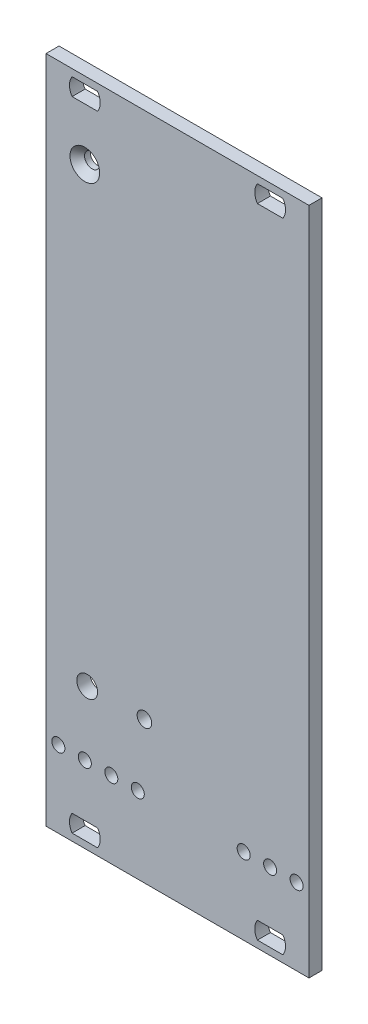
ISO-10303-21;
HEADER;
FILE_DESCRIPTION(('STEP AP214'),'2;1');
FILE_NAME('part.step','',(''),(''),'','','');
FILE_SCHEMA(('AUTOMOTIVE_DESIGN { 1 0 10303 214 1 1 1 1 }'));
ENDSEC;
DATA;
#1=APPLICATION_CONTEXT('core data for automotive mechanical design processes');
#2=APPLICATION_PROTOCOL_DEFINITION('international standard','automotive_design',2000,#1);
#3=PRODUCT_CONTEXT('',#1,'mechanical');
#4=PRODUCT('Part','Part','',(#3));
#5=PRODUCT_RELATED_PRODUCT_CATEGORY('part','',(#4));
#6=PRODUCT_DEFINITION_FORMATION('','',#4);
#7=PRODUCT_DEFINITION_CONTEXT('part definition',#1,'design');
#8=PRODUCT_DEFINITION('design','',#6,#7);
#9=PRODUCT_DEFINITION_SHAPE('','',#8);
#10=(LENGTH_UNIT() NAMED_UNIT(*) SI_UNIT(.MILLI.,.METRE.));
#11=(NAMED_UNIT(*) PLANE_ANGLE_UNIT() SI_UNIT($,.RADIAN.));
#12=(NAMED_UNIT(*) SI_UNIT($,.STERADIAN.) SOLID_ANGLE_UNIT());
#13=UNCERTAINTY_MEASURE_WITH_UNIT(LENGTH_MEASURE(1.E-05),#10,'distance_accuracy_value','');
#14=(GEOMETRIC_REPRESENTATION_CONTEXT(3) GLOBAL_UNCERTAINTY_ASSIGNED_CONTEXT((#13)) GLOBAL_UNIT_ASSIGNED_CONTEXT((#10,
#11,#12)) REPRESENTATION_CONTEXT('',''));
#15=CARTESIAN_POINT('',(0.,0.,0.));
#16=DIRECTION('',(0.,0.,1.));
#17=DIRECTION('',(1.,0.,0.));
#18=AXIS2_PLACEMENT_3D('',#15,#16,#17);
#19=CARTESIAN_POINT('',(0.,0.,2.5));
#20=DIRECTION('',(0.,0.,-1.));
#21=DIRECTION('',(-1.,0.,0.));
#22=AXIS2_PLACEMENT_3D('',#19,#20,#21);
#23=PLANE('',#22);
#24=CARTESIAN_POINT('',(7.90057350751283,27.2004615016538,2.5));
#25=DIRECTION('',(0.,0.,1.));
#26=DIRECTION('',(1.,0.,0.));
#27=AXIS2_PLACEMENT_3D('',#24,#25,#26);
#28=CIRCLE('',#27,2.);
#29=CARTESIAN_POINT('',(9.90057350751283,27.2004615016538,2.5));
#30=VERTEX_POINT('',#29);
#31=EDGE_CURVE('E776',#30,#30,#28,.T.);
#32=ORIENTED_EDGE('',*,*,#31,.F.);
#33=EDGE_LOOP('',(#32));
#34=FACE_BOUND('',#33,.T.);
#35=CARTESIAN_POINT('',(18.8873679253856,27.2115592669931,2.5));
#36=DIRECTION('',(0.,0.,1.));
#37=DIRECTION('',(1.,0.,0.));
#38=AXIS2_PLACEMENT_3D('',#35,#36,#37);
#39=CIRCLE('',#38,1.4);
#40=CARTESIAN_POINT('',(20.2873679253856,27.2115592669931,2.5));
#41=VERTEX_POINT('',#40);
#42=EDGE_CURVE('E778',#41,#41,#39,.T.);
#43=ORIENTED_EDGE('',*,*,#42,.F.);
#44=EDGE_LOOP('',(#43));
#45=FACE_BOUND('',#44,.T.);
#46=CARTESIAN_POINT('',(7.45,113.7,2.5));
#47=DIRECTION('',(0.,0.,-1.));
#48=DIRECTION('',(-1.,0.,0.));
#49=AXIS2_PLACEMENT_3D('',#46,#47,#48);
#50=CIRCLE('',#49,2.85000000000003);
#51=CARTESIAN_POINT('',(4.59999999999997,113.7,2.5));
#52=VERTEX_POINT('',#51);
#53=EDGE_CURVE('E11',#52,#52,#50,.T.);
#54=ORIENTED_EDGE('',*,*,#53,.T.);
#55=EDGE_LOOP('',(#54));
#56=FACE_BOUND('',#55,.T.);
#57=CARTESIAN_POINT('',(43.01,3.,2.5));
#58=DIRECTION('',(0.,0.,1.));
#59=DIRECTION('',(-1.,0.,0.));
#60=AXIS2_PLACEMENT_3D('',#57,#58,#59);
#61=CIRCLE('',#60,2.95);
#62=CARTESIAN_POINT('',(40.5645961478725,4.65,2.5));
#63=VERTEX_POINT('',#62);
#64=CARTESIAN_POINT('',(40.5645961478725,1.35000000000002,2.5));
#65=VERTEX_POINT('',#64);
#66=EDGE_CURVE('E214',#63,#65,#61,.T.);
#67=ORIENTED_EDGE('',*,*,#66,.F.);
#68=DIRECTION('',(-1.,0.,0.));
#69=VECTOR('',#68,1.);
#70=CARTESIAN_POINT('',(45.4554038521275,4.65,2.5));
#71=LINE('',#70,#69);
#72=CARTESIAN_POINT('',(45.4554038521275,4.65,2.5));
#73=VERTEX_POINT('',#72);
#74=EDGE_CURVE('E222',#73,#63,#71,.T.);
#75=ORIENTED_EDGE('',*,*,#74,.F.);
#76=CARTESIAN_POINT('',(43.01,3.,2.5));
#77=DIRECTION('',(0.,0.,1.));
#78=DIRECTION('',(-1.,0.,0.));
#79=AXIS2_PLACEMENT_3D('',#76,#77,#78);
#80=CIRCLE('',#79,2.95);
#81=CARTESIAN_POINT('',(45.4554038521275,1.35000000000002,2.5));
#82=VERTEX_POINT('',#81);
#83=EDGE_CURVE('E219',#82,#73,#80,.T.);
#84=ORIENTED_EDGE('',*,*,#83,.F.);
#85=DIRECTION('',(1.,0.,0.));
#86=VECTOR('',#85,1.);
#87=CARTESIAN_POINT('',(40.5645961478725,1.35000000000002,2.5));
#88=LINE('',#87,#86);
#89=EDGE_CURVE('E216',#65,#82,#88,.T.);
#90=ORIENTED_EDGE('',*,*,#89,.F.);
#91=EDGE_LOOP('',(#67,#75,#84,#90));
#92=FACE_BOUND('',#91,.T.);
#93=CARTESIAN_POINT('',(43.01,14.7000000000001,2.5));
#94=DIRECTION('',(0.,0.,1.));
#95=DIRECTION('',(-1.,0.,0.));
#96=AXIS2_PLACEMENT_3D('',#93,#94,#95);
#97=CIRCLE('',#96,1.24999999999998);
#98=CARTESIAN_POINT('',(41.76,14.7000000000001,2.5));
#99=VERTEX_POINT('',#98);
#100=EDGE_CURVE('E251',#99,#99,#97,.T.);
#101=ORIENTED_EDGE('',*,*,#100,.F.);
#102=EDGE_LOOP('',(#101));
#103=FACE_BOUND('',#102,.T.);
#104=CARTESIAN_POINT('',(17.61,14.7,2.5));
#105=DIRECTION('',(0.,0.,1.));
#106=DIRECTION('',(1.,0.,0.));
#107=AXIS2_PLACEMENT_3D('',#104,#105,#106);
#108=CIRCLE('',#107,1.24999999999997);
#109=CARTESIAN_POINT('',(18.86,14.7,2.5));
#110=VERTEX_POINT('',#109);
#111=EDGE_CURVE('E263',#110,#110,#108,.T.);
#112=ORIENTED_EDGE('',*,*,#111,.F.);
#113=EDGE_LOOP('',(#112));
#114=FACE_BOUND('',#113,.T.);
#115=CARTESIAN_POINT('',(7.45000000000001,14.7,2.5));
#116=DIRECTION('',(0.,0.,1.));
#117=DIRECTION('',(1.,0.,0.));
#118=AXIS2_PLACEMENT_3D('',#115,#116,#117);
#119=CIRCLE('',#118,1.24999999999997);
#120=CARTESIAN_POINT('',(8.69999999999999,14.7,2.5));
#121=VERTEX_POINT('',#120);
#122=EDGE_CURVE('E335',#121,#121,#119,.T.);
#123=ORIENTED_EDGE('',*,*,#122,.F.);
#124=EDGE_LOOP('',(#123));
#125=FACE_BOUND('',#124,.T.);
#126=CARTESIAN_POINT('',(2.37000000000001,14.7,2.5));
#127=DIRECTION('',(0.,0.,1.));
#128=DIRECTION('',(1.,0.,0.));
#129=AXIS2_PLACEMENT_3D('',#126,#127,#128);
#130=CIRCLE('',#129,1.25000000000003);
#131=CARTESIAN_POINT('',(3.62000000000004,14.7,2.5));
#132=VERTEX_POINT('',#131);
#133=EDGE_CURVE('E349',#132,#132,#130,.T.);
#134=ORIENTED_EDGE('',*,*,#133,.F.);
#135=EDGE_LOOP('',(#134));
#136=FACE_BOUND('',#135,.T.);
#137=DIRECTION('',(0.,-1.,0.));
#138=VECTOR('',#137,1.);
#139=CARTESIAN_POINT('',(0.,0.,2.5));
#140=LINE('',#139,#138);
#141=CARTESIAN_POINT('',(0.,128.4,2.5));
#142=VERTEX_POINT('',#141);
#143=CARTESIAN_POINT('',(0.,0.,2.5));
#144=VERTEX_POINT('',#143);
#145=EDGE_CURVE('E357',#142,#144,#140,.T.);
#146=ORIENTED_EDGE('',*,*,#145,.T.);
#147=DIRECTION('',(1.,0.,0.));
#148=VECTOR('',#147,1.);
#149=CARTESIAN_POINT('',(50.46,0.,2.5));
#150=LINE('',#149,#148);
#151=CARTESIAN_POINT('',(50.46,0.,2.5));
#152=VERTEX_POINT('',#151);
#153=EDGE_CURVE('E360',#144,#152,#150,.T.);
#154=ORIENTED_EDGE('',*,*,#153,.T.);
#155=DIRECTION('',(0.,1.,0.));
#156=VECTOR('',#155,1.);
#157=CARTESIAN_POINT('',(50.46,128.4,2.5));
#158=LINE('',#157,#156);
#159=CARTESIAN_POINT('',(50.46,128.4,2.5));
#160=VERTEX_POINT('',#159);
#161=EDGE_CURVE('E363',#152,#160,#158,.T.);
#162=ORIENTED_EDGE('',*,*,#161,.T.);
#163=DIRECTION('',(-1.,0.,0.));
#164=VECTOR('',#163,1.);
#165=CARTESIAN_POINT('',(0.,128.4,2.5));
#166=LINE('',#165,#164);
#167=EDGE_CURVE('E365',#160,#142,#166,.T.);
#168=ORIENTED_EDGE('',*,*,#167,.T.);
#169=EDGE_LOOP('',(#146,#154,#162,#168));
#170=FACE_BOUND('',#169,.T.);
#171=CARTESIAN_POINT('',(12.53,14.7,2.5));
#172=DIRECTION('',(0.,0.,1.));
#173=DIRECTION('',(1.,0.,0.));
#174=AXIS2_PLACEMENT_3D('',#171,#172,#173);
#175=CIRCLE('',#174,1.25000000000003);
#176=CARTESIAN_POINT('',(13.78,14.7,2.5));
#177=VERTEX_POINT('',#176);
#178=EDGE_CURVE('E343',#177,#177,#175,.T.);
#179=ORIENTED_EDGE('',*,*,#178,.F.);
#180=EDGE_LOOP('',(#179));
#181=FACE_BOUND('',#180,.T.);
#182=CARTESIAN_POINT('',(7.45000000000001,3.,2.5));
#183=DIRECTION('',(0.,0.,1.));
#184=DIRECTION('',(1.,0.,0.));
#185=AXIS2_PLACEMENT_3D('',#182,#183,#184);
#186=CIRCLE('',#185,2.95);
#187=CARTESIAN_POINT('',(5.00459614787252,4.65,2.5));
#188=VERTEX_POINT('',#187);
#189=CARTESIAN_POINT('',(5.00459614787252,1.35,2.5));
#190=VERTEX_POINT('',#189);
#191=EDGE_CURVE('E304',#188,#190,#186,.T.);
#192=ORIENTED_EDGE('',*,*,#191,.F.);
#193=DIRECTION('',(-1.,0.,0.));
#194=VECTOR('',#193,1.);
#195=CARTESIAN_POINT('',(5.00459614787252,4.65,2.5));
#196=LINE('',#195,#194);
#197=CARTESIAN_POINT('',(9.89540385212751,4.65,2.5));
#198=VERTEX_POINT('',#197);
#199=EDGE_CURVE('E312',#198,#188,#196,.T.);
#200=ORIENTED_EDGE('',*,*,#199,.F.);
#201=CARTESIAN_POINT('',(7.45000000000001,3.,2.5));
#202=DIRECTION('',(0.,0.,1.));
#203=DIRECTION('',(1.,0.,0.));
#204=AXIS2_PLACEMENT_3D('',#201,#202,#203);
#205=CIRCLE('',#204,2.95);
#206=CARTESIAN_POINT('',(9.89540385212751,1.35,2.5));
#207=VERTEX_POINT('',#206);
#208=EDGE_CURVE('E309',#207,#198,#205,.T.);
#209=ORIENTED_EDGE('',*,*,#208,.F.);
#210=DIRECTION('',(1.,0.,0.));
#211=VECTOR('',#210,1.);
#212=CARTESIAN_POINT('',(9.89540385212751,1.35,2.5));
#213=LINE('',#212,#211);
#214=EDGE_CURVE('E306',#190,#207,#213,.T.);
#215=ORIENTED_EDGE('',*,*,#214,.F.);
#216=EDGE_LOOP('',(#192,#200,#209,#215));
#217=FACE_BOUND('',#216,.T.);
#218=CARTESIAN_POINT('',(7.45,125.4,2.5));
#219=DIRECTION('',(0.,0.,1.));
#220=DIRECTION('',(1.,0.,0.));
#221=AXIS2_PLACEMENT_3D('',#218,#219,#220);
#222=CIRCLE('',#221,2.95000000000001);
#223=CARTESIAN_POINT('',(5.00459614787251,127.05,2.5));
#224=VERTEX_POINT('',#223);
#225=CARTESIAN_POINT('',(5.00459614787247,123.75,2.5));
#226=VERTEX_POINT('',#225);
#227=EDGE_CURVE('E269',#224,#226,#222,.T.);
#228=ORIENTED_EDGE('',*,*,#227,.F.);
#229=DIRECTION('',(-1.,0.,0.));
#230=VECTOR('',#229,1.);
#231=CARTESIAN_POINT('',(5.00459614787251,127.05,2.5));
#232=LINE('',#231,#230);
#233=CARTESIAN_POINT('',(9.89540385212749,127.05,2.5));
#234=VERTEX_POINT('',#233);
#235=EDGE_CURVE('E277',#234,#224,#232,.T.);
#236=ORIENTED_EDGE('',*,*,#235,.F.);
#237=CARTESIAN_POINT('',(7.45,125.4,2.5));
#238=DIRECTION('',(0.,0.,1.));
#239=DIRECTION('',(1.,0.,0.));
#240=AXIS2_PLACEMENT_3D('',#237,#238,#239);
#241=CIRCLE('',#240,2.95000000000001);
#242=CARTESIAN_POINT('',(9.89540385212751,123.75,2.5));
#243=VERTEX_POINT('',#242);
#244=EDGE_CURVE('E274',#243,#234,#241,.T.);
#245=ORIENTED_EDGE('',*,*,#244,.F.);
#246=DIRECTION('',(1.,0.,0.));
#247=VECTOR('',#246,1.);
#248=CARTESIAN_POINT('',(9.89540385212753,123.75,2.5));
#249=LINE('',#248,#247);
#250=EDGE_CURVE('E271',#226,#243,#249,.T.);
#251=ORIENTED_EDGE('',*,*,#250,.F.);
#252=EDGE_LOOP('',(#228,#236,#245,#251));
#253=FACE_BOUND('',#252,.T.);
#254=CARTESIAN_POINT('',(37.93,14.7,2.5));
#255=DIRECTION('',(0.,0.,1.));
#256=DIRECTION('',(-1.,0.,0.));
#257=AXIS2_PLACEMENT_3D('',#254,#255,#256);
#258=CIRCLE('',#257,1.25000000000003);
#259=CARTESIAN_POINT('',(36.68,14.7,2.5));
#260=VERTEX_POINT('',#259);
#261=EDGE_CURVE('E257',#260,#260,#258,.T.);
#262=ORIENTED_EDGE('',*,*,#261,.F.);
#263=EDGE_LOOP('',(#262));
#264=FACE_BOUND('',#263,.T.);
#265=CARTESIAN_POINT('',(48.09,14.7000000000001,2.5));
#266=DIRECTION('',(0.,0.,1.));
#267=DIRECTION('',(-1.,0.,0.));
#268=AXIS2_PLACEMENT_3D('',#265,#266,#267);
#269=CIRCLE('',#268,1.25000000000003);
#270=CARTESIAN_POINT('',(46.84,14.7000000000001,2.5));
#271=VERTEX_POINT('',#270);
#272=EDGE_CURVE('E245',#271,#271,#269,.T.);
#273=ORIENTED_EDGE('',*,*,#272,.F.);
#274=EDGE_LOOP('',(#273));
#275=FACE_BOUND('',#274,.T.);
#276=CARTESIAN_POINT('',(43.01,125.4,2.5));
#277=DIRECTION('',(0.,0.,1.));
#278=DIRECTION('',(-1.,0.,0.));
#279=AXIS2_PLACEMENT_3D('',#276,#277,#278);
#280=CIRCLE('',#279,2.95);
#281=CARTESIAN_POINT('',(40.5645961478725,127.05,2.5));
#282=VERTEX_POINT('',#281);
#283=CARTESIAN_POINT('',(40.5645961478725,123.75,2.5));
#284=VERTEX_POINT('',#283);
#285=EDGE_CURVE('E176',#282,#284,#280,.T.);
#286=ORIENTED_EDGE('',*,*,#285,.F.);
#287=DIRECTION('',(-1.,0.,0.));
#288=VECTOR('',#287,1.);
#289=CARTESIAN_POINT('',(45.4554038521275,127.05,2.5));
#290=LINE('',#289,#288);
#291=CARTESIAN_POINT('',(45.4554038521275,127.05,2.5));
#292=VERTEX_POINT('',#291);
#293=EDGE_CURVE('E198',#292,#282,#290,.T.);
#294=ORIENTED_EDGE('',*,*,#293,.F.);
#295=CARTESIAN_POINT('',(43.01,125.4,2.5));
#296=DIRECTION('',(0.,0.,1.));
#297=DIRECTION('',(-1.,0.,0.));
#298=AXIS2_PLACEMENT_3D('',#295,#296,#297);
#299=CIRCLE('',#298,2.94999999999999);
#300=CARTESIAN_POINT('',(45.4554038521275,123.75,2.5));
#301=VERTEX_POINT('',#300);
#302=EDGE_CURVE('E196',#301,#292,#299,.T.);
#303=ORIENTED_EDGE('',*,*,#302,.F.);
#304=DIRECTION('',(1.,0.,0.));
#305=VECTOR('',#304,1.);
#306=CARTESIAN_POINT('',(40.5645961478725,123.75,2.5));
#307=LINE('',#306,#305);
#308=EDGE_CURVE('E184',#284,#301,#307,.T.);
#309=ORIENTED_EDGE('',*,*,#308,.F.);
#310=EDGE_LOOP('',(#286,#294,#303,#309));
#311=FACE_BOUND('',#310,.T.);
#312=ADVANCED_FACE('F38',(#34,#45,#56,#92,#103,#114,#125,#136,#170,#181,#217,#253,#264,#275,
#311),#23,.F.);
#313=CARTESIAN_POINT('',(0.,0.,0.));
#314=DIRECTION('',(0.,0.,-1.));
#315=DIRECTION('',(-1.,0.,0.));
#316=AXIS2_PLACEMENT_3D('',#313,#314,#315);
#317=PLANE('',#316);
#318=CARTESIAN_POINT('',(7.90057350751283,27.2004615016538,0.));
#319=DIRECTION('',(0.,0.,1.));
#320=DIRECTION('',(1.,0.,0.));
#321=AXIS2_PLACEMENT_3D('',#318,#319,#320);
#322=CIRCLE('',#321,2.);
#323=CARTESIAN_POINT('',(9.90057350751283,27.2004615016538,0.));
#324=VERTEX_POINT('',#323);
#325=EDGE_CURVE('E774',#324,#324,#322,.T.);
#326=ORIENTED_EDGE('',*,*,#325,.T.);
#327=EDGE_LOOP('',(#326));
#328=FACE_BOUND('',#327,.T.);
#329=CARTESIAN_POINT('',(18.8873679253856,27.2115592669931,0.));
#330=DIRECTION('',(0.,0.,1.));
#331=DIRECTION('',(1.,0.,0.));
#332=AXIS2_PLACEMENT_3D('',#329,#330,#331);
#333=CIRCLE('',#332,1.4);
#334=CARTESIAN_POINT('',(20.2873679253856,27.2115592669931,0.));
#335=VERTEX_POINT('',#334);
#336=EDGE_CURVE('E204',#335,#335,#333,.T.);
#337=ORIENTED_EDGE('',*,*,#336,.T.);
#338=EDGE_LOOP('',(#337));
#339=FACE_BOUND('',#338,.T.);
#340=DIRECTION('',(-1.,0.,0.));
#341=VECTOR('',#340,1.);
#342=CARTESIAN_POINT('',(45.4554038521275,4.65,0.));
#343=LINE('',#342,#341);
#344=CARTESIAN_POINT('',(45.4554038521275,4.65,0.));
#345=VERTEX_POINT('',#344);
#346=CARTESIAN_POINT('',(40.5645961478725,4.65,0.));
#347=VERTEX_POINT('',#346);
#348=EDGE_CURVE('E217',#345,#347,#343,.T.);
#349=ORIENTED_EDGE('',*,*,#348,.T.);
#350=CARTESIAN_POINT('',(43.01,3.,0.));
#351=DIRECTION('',(0.,0.,1.));
#352=DIRECTION('',(-1.,0.,0.));
#353=AXIS2_PLACEMENT_3D('',#350,#351,#352);
#354=CIRCLE('',#353,2.95);
#355=CARTESIAN_POINT('',(40.5645961478725,1.35000000000002,0.));
#356=VERTEX_POINT('',#355);
#357=EDGE_CURVE('E192',#347,#356,#354,.T.);
#358=ORIENTED_EDGE('',*,*,#357,.T.);
#359=DIRECTION('',(1.,0.,0.));
#360=VECTOR('',#359,1.);
#361=CARTESIAN_POINT('',(40.5645961478725,1.35000000000002,0.));
#362=LINE('',#361,#360);
#363=CARTESIAN_POINT('',(45.4554038521275,1.35000000000002,0.));
#364=VERTEX_POINT('',#363);
#365=EDGE_CURVE('E227',#356,#364,#362,.T.);
#366=ORIENTED_EDGE('',*,*,#365,.T.);
#367=CARTESIAN_POINT('',(43.01,3.,0.));
#368=DIRECTION('',(0.,0.,1.));
#369=DIRECTION('',(-1.,0.,0.));
#370=AXIS2_PLACEMENT_3D('',#367,#368,#369);
#371=CIRCLE('',#370,2.95);
#372=EDGE_CURVE('E230',#364,#345,#371,.T.);
#373=ORIENTED_EDGE('',*,*,#372,.T.);
#374=EDGE_LOOP('',(#349,#358,#366,#373));
#375=FACE_BOUND('',#374,.T.);
#376=CARTESIAN_POINT('',(43.01,14.7000000000001,0.));
#377=DIRECTION('',(0.,0.,1.));
#378=DIRECTION('',(-1.,0.,0.));
#379=AXIS2_PLACEMENT_3D('',#376,#377,#378);
#380=CIRCLE('',#379,1.24999999999998);
#381=CARTESIAN_POINT('',(41.76,14.7000000000001,0.));
#382=VERTEX_POINT('',#381);
#383=EDGE_CURVE('E248',#382,#382,#380,.T.);
#384=ORIENTED_EDGE('',*,*,#383,.T.);
#385=EDGE_LOOP('',(#384));
#386=FACE_BOUND('',#385,.T.);
#387=CARTESIAN_POINT('',(17.61,14.7,0.));
#388=DIRECTION('',(0.,0.,1.));
#389=DIRECTION('',(1.,0.,0.));
#390=AXIS2_PLACEMENT_3D('',#387,#388,#389);
#391=CIRCLE('',#390,1.24999999999997);
#392=CARTESIAN_POINT('',(18.86,14.7,0.));
#393=VERTEX_POINT('',#392);
#394=EDGE_CURVE('E260',#393,#393,#391,.T.);
#395=ORIENTED_EDGE('',*,*,#394,.T.);
#396=EDGE_LOOP('',(#395));
#397=FACE_BOUND('',#396,.T.);
#398=CARTESIAN_POINT('',(7.45,113.7,0.));
#399=DIRECTION('',(0.,0.,1.));
#400=DIRECTION('',(1.,0.,0.));
#401=AXIS2_PLACEMENT_3D('',#398,#399,#400);
#402=CIRCLE('',#401,1.45000000000001);
#403=CARTESIAN_POINT('',(8.90000000000001,113.7,0.));
#404=VERTEX_POINT('',#403);
#405=EDGE_CURVE('E299',#404,#404,#402,.T.);
#406=ORIENTED_EDGE('',*,*,#405,.T.);
#407=EDGE_LOOP('',(#406));
#408=FACE_BOUND('',#407,.T.);
#409=CARTESIAN_POINT('',(7.45000000000001,14.7,0.));
#410=DIRECTION('',(0.,0.,1.));
#411=DIRECTION('',(1.,0.,0.));
#412=AXIS2_PLACEMENT_3D('',#409,#410,#411);
#413=CIRCLE('',#412,1.24999999999997);
#414=CARTESIAN_POINT('',(8.69999999999999,14.7,0.));
#415=VERTEX_POINT('',#414);
#416=EDGE_CURVE('E334',#415,#415,#413,.T.);
#417=ORIENTED_EDGE('',*,*,#416,.T.);
#418=EDGE_LOOP('',(#417));
#419=FACE_BOUND('',#418,.T.);
#420=CARTESIAN_POINT('',(2.37000000000001,14.7,0.));
#421=DIRECTION('',(0.,0.,1.));
#422=DIRECTION('',(1.,0.,0.));
#423=AXIS2_PLACEMENT_3D('',#420,#421,#422);
#424=CIRCLE('',#423,1.25000000000003);
#425=CARTESIAN_POINT('',(3.62000000000004,14.7,0.));
#426=VERTEX_POINT('',#425);
#427=EDGE_CURVE('E346',#426,#426,#424,.T.);
#428=ORIENTED_EDGE('',*,*,#427,.T.);
#429=EDGE_LOOP('',(#428));
#430=FACE_BOUND('',#429,.T.);
#431=DIRECTION('',(0.,-1.,0.));
#432=VECTOR('',#431,1.);
#433=CARTESIAN_POINT('',(0.,0.,0.));
#434=LINE('',#433,#432);
#435=CARTESIAN_POINT('',(0.,128.4,0.));
#436=VERTEX_POINT('',#435);
#437=CARTESIAN_POINT('',(0.,0.,0.));
#438=VERTEX_POINT('',#437);
#439=EDGE_CURVE('E353',#436,#438,#434,.T.);
#440=ORIENTED_EDGE('',*,*,#439,.F.);
#441=DIRECTION('',(-1.,0.,0.));
#442=VECTOR('',#441,1.);
#443=CARTESIAN_POINT('',(0.,128.4,0.));
#444=LINE('',#443,#442);
#445=CARTESIAN_POINT('',(50.46,128.4,0.));
#446=VERTEX_POINT('',#445);
#447=EDGE_CURVE('E361',#446,#436,#444,.T.);
#448=ORIENTED_EDGE('',*,*,#447,.F.);
#449=DIRECTION('',(0.,1.,0.));
#450=VECTOR('',#449,1.);
#451=CARTESIAN_POINT('',(50.46,128.4,0.));
#452=LINE('',#451,#450);
#453=CARTESIAN_POINT('',(50.46,0.,0.));
#454=VERTEX_POINT('',#453);
#455=EDGE_CURVE('E372',#454,#446,#452,.T.);
#456=ORIENTED_EDGE('',*,*,#455,.F.);
#457=DIRECTION('',(1.,0.,0.));
#458=VECTOR('',#457,1.);
#459=CARTESIAN_POINT('',(50.46,0.,0.));
#460=LINE('',#459,#458);
#461=EDGE_CURVE('E370',#438,#454,#460,.T.);
#462=ORIENTED_EDGE('',*,*,#461,.F.);
#463=EDGE_LOOP('',(#440,#448,#456,#462));
#464=FACE_BOUND('',#463,.T.);
#465=CARTESIAN_POINT('',(12.53,14.7,0.));
#466=DIRECTION('',(0.,0.,1.));
#467=DIRECTION('',(1.,0.,0.));
#468=AXIS2_PLACEMENT_3D('',#465,#466,#467);
#469=CIRCLE('',#468,1.25000000000003);
#470=CARTESIAN_POINT('',(13.78,14.7,0.));
#471=VERTEX_POINT('',#470);
#472=EDGE_CURVE('E339',#471,#471,#469,.T.);
#473=ORIENTED_EDGE('',*,*,#472,.T.);
#474=EDGE_LOOP('',(#473));
#475=FACE_BOUND('',#474,.T.);
#476=DIRECTION('',(-1.,0.,0.));
#477=VECTOR('',#476,1.);
#478=CARTESIAN_POINT('',(5.00459614787252,4.65,0.));
#479=LINE('',#478,#477);
#480=CARTESIAN_POINT('',(9.89540385212751,4.65,0.));
#481=VERTEX_POINT('',#480);
#482=CARTESIAN_POINT('',(5.00459614787252,4.65,0.));
#483=VERTEX_POINT('',#482);
#484=EDGE_CURVE('E307',#481,#483,#479,.T.);
#485=ORIENTED_EDGE('',*,*,#484,.T.);
#486=CARTESIAN_POINT('',(7.45000000000001,3.,0.));
#487=DIRECTION('',(0.,0.,1.));
#488=DIRECTION('',(1.,0.,0.));
#489=AXIS2_PLACEMENT_3D('',#486,#487,#488);
#490=CIRCLE('',#489,2.95);
#491=CARTESIAN_POINT('',(5.00459614787252,1.35,0.));
#492=VERTEX_POINT('',#491);
#493=EDGE_CURVE('E303',#483,#492,#490,.T.);
#494=ORIENTED_EDGE('',*,*,#493,.T.);
#495=DIRECTION('',(1.,0.,0.));
#496=VECTOR('',#495,1.);
#497=CARTESIAN_POINT('',(9.89540385212751,1.35,0.));
#498=LINE('',#497,#496);
#499=CARTESIAN_POINT('',(9.89540385212751,1.35,0.));
#500=VERTEX_POINT('',#499);
#501=EDGE_CURVE('E317',#492,#500,#498,.T.);
#502=ORIENTED_EDGE('',*,*,#501,.T.);
#503=CARTESIAN_POINT('',(7.45000000000001,3.,0.));
#504=DIRECTION('',(0.,0.,1.));
#505=DIRECTION('',(1.,0.,0.));
#506=AXIS2_PLACEMENT_3D('',#503,#504,#505);
#507=CIRCLE('',#506,2.95);
#508=EDGE_CURVE('E320',#500,#481,#507,.T.);
#509=ORIENTED_EDGE('',*,*,#508,.T.);
#510=EDGE_LOOP('',(#485,#494,#502,#509));
#511=FACE_BOUND('',#510,.T.);
#512=DIRECTION('',(-1.,0.,0.));
#513=VECTOR('',#512,1.);
#514=CARTESIAN_POINT('',(5.00459614787251,127.05,0.));
#515=LINE('',#514,#513);
#516=CARTESIAN_POINT('',(9.89540385212749,127.05,0.));
#517=VERTEX_POINT('',#516);
#518=CARTESIAN_POINT('',(5.00459614787251,127.05,0.));
#519=VERTEX_POINT('',#518);
#520=EDGE_CURVE('E272',#517,#519,#515,.T.);
#521=ORIENTED_EDGE('',*,*,#520,.T.);
#522=CARTESIAN_POINT('',(7.45,125.4,0.));
#523=DIRECTION('',(0.,0.,1.));
#524=DIRECTION('',(1.,0.,0.));
#525=AXIS2_PLACEMENT_3D('',#522,#523,#524);
#526=CIRCLE('',#525,2.95000000000001);
#527=CARTESIAN_POINT('',(5.00459614787247,123.75,0.));
#528=VERTEX_POINT('',#527);
#529=EDGE_CURVE('E266',#519,#528,#526,.T.);
#530=ORIENTED_EDGE('',*,*,#529,.T.);
#531=DIRECTION('',(1.,0.,0.));
#532=VECTOR('',#531,1.);
#533=CARTESIAN_POINT('',(9.89540385212753,123.75,0.));
#534=LINE('',#533,#532);
#535=CARTESIAN_POINT('',(9.89540385212751,123.75,0.));
#536=VERTEX_POINT('',#535);
#537=EDGE_CURVE('E282',#528,#536,#534,.T.);
#538=ORIENTED_EDGE('',*,*,#537,.T.);
#539=CARTESIAN_POINT('',(7.45,125.4,0.));
#540=DIRECTION('',(0.,0.,1.));
#541=DIRECTION('',(1.,0.,0.));
#542=AXIS2_PLACEMENT_3D('',#539,#540,#541);
#543=CIRCLE('',#542,2.95000000000001);
#544=EDGE_CURVE('E285',#536,#517,#543,.T.);
#545=ORIENTED_EDGE('',*,*,#544,.T.);
#546=EDGE_LOOP('',(#521,#530,#538,#545));
#547=FACE_BOUND('',#546,.T.);
#548=CARTESIAN_POINT('',(37.93,14.7,0.));
#549=DIRECTION('',(0.,0.,1.));
#550=DIRECTION('',(-1.,0.,0.));
#551=AXIS2_PLACEMENT_3D('',#548,#549,#550);
#552=CIRCLE('',#551,1.25000000000003);
#553=CARTESIAN_POINT('',(36.68,14.7,0.));
#554=VERTEX_POINT('',#553);
#555=EDGE_CURVE('E254',#554,#554,#552,.T.);
#556=ORIENTED_EDGE('',*,*,#555,.T.);
#557=EDGE_LOOP('',(#556));
#558=FACE_BOUND('',#557,.T.);
#559=CARTESIAN_POINT('',(48.09,14.7000000000001,0.));
#560=DIRECTION('',(0.,0.,1.));
#561=DIRECTION('',(-1.,0.,0.));
#562=AXIS2_PLACEMENT_3D('',#559,#560,#561);
#563=CIRCLE('',#562,1.25000000000003);
#564=CARTESIAN_POINT('',(46.84,14.7000000000001,0.));
#565=VERTEX_POINT('',#564);
#566=EDGE_CURVE('E244',#565,#565,#563,.T.);
#567=ORIENTED_EDGE('',*,*,#566,.T.);
#568=EDGE_LOOP('',(#567));
#569=FACE_BOUND('',#568,.T.);
#570=DIRECTION('',(-1.,0.,0.));
#571=VECTOR('',#570,1.);
#572=CARTESIAN_POINT('',(45.4554038521275,127.05,0.));
#573=LINE('',#572,#571);
#574=CARTESIAN_POINT('',(45.4554038521275,127.05,0.));
#575=VERTEX_POINT('',#574);
#576=CARTESIAN_POINT('',(40.5645961478725,127.05,0.));
#577=VERTEX_POINT('',#576);
#578=EDGE_CURVE('E185',#575,#577,#573,.T.);
#579=ORIENTED_EDGE('',*,*,#578,.T.);
#580=CARTESIAN_POINT('',(43.01,125.4,0.));
#581=DIRECTION('',(0.,0.,1.));
#582=DIRECTION('',(-1.,0.,0.));
#583=AXIS2_PLACEMENT_3D('',#580,#581,#582);
#584=CIRCLE('',#583,2.95);
#585=CARTESIAN_POINT('',(40.5645961478725,123.75,0.));
#586=VERTEX_POINT('',#585);
#587=EDGE_CURVE('E62',#577,#586,#584,.T.);
#588=ORIENTED_EDGE('',*,*,#587,.T.);
#589=DIRECTION('',(1.,0.,0.));
#590=VECTOR('',#589,1.);
#591=CARTESIAN_POINT('',(40.5645961478725,123.75,0.));
#592=LINE('',#591,#590);
#593=CARTESIAN_POINT('',(45.4554038521275,123.75,0.));
#594=VERTEX_POINT('',#593);
#595=EDGE_CURVE('E191',#586,#594,#592,.T.);
#596=ORIENTED_EDGE('',*,*,#595,.T.);
#597=CARTESIAN_POINT('',(43.01,125.4,0.));
#598=DIRECTION('',(0.,0.,1.));
#599=DIRECTION('',(-1.,0.,0.));
#600=AXIS2_PLACEMENT_3D('',#597,#598,#599);
#601=CIRCLE('',#600,2.94999999999999);
#602=EDGE_CURVE('E206',#594,#575,#601,.T.);
#603=ORIENTED_EDGE('',*,*,#602,.T.);
#604=EDGE_LOOP('',(#579,#588,#596,#603));
#605=FACE_BOUND('',#604,.T.);
#606=ADVANCED_FACE('F407',(#328,#339,#375,#386,#397,#408,#419,#430,#464,#475,#511,#547,#558,
#569,#605),#317,.T.);
#607=CARTESIAN_POINT('',(0.,0.,2.5));
#608=DIRECTION('',(1.,0.,0.));
#609=DIRECTION('',(0.,0.,-1.));
#610=AXIS2_PLACEMENT_3D('',#607,#608,#609);
#611=PLANE('',#610);
#612=ORIENTED_EDGE('',*,*,#439,.T.);
#613=DIRECTION('',(0.,0.,-1.));
#614=VECTOR('',#613,1.);
#615=CARTESIAN_POINT('',(0.,0.,2.5));
#616=LINE('',#615,#614);
#617=EDGE_CURVE('E383',#144,#438,#616,.T.);
#618=ORIENTED_EDGE('',*,*,#617,.F.);
#619=ORIENTED_EDGE('',*,*,#145,.F.);
#620=DIRECTION('',(0.,0.,-1.));
#621=VECTOR('',#620,1.);
#622=CARTESIAN_POINT('',(0.,128.4,2.5));
#623=LINE('',#622,#621);
#624=EDGE_CURVE('E367',#142,#436,#623,.T.);
#625=ORIENTED_EDGE('',*,*,#624,.T.);
#626=EDGE_LOOP('',(#612,#618,#619,#625));
#627=FACE_BOUND('',#626,.T.);
#628=ADVANCED_FACE('F412',(#627),#611,.F.);
#629=CARTESIAN_POINT('',(50.46,0.,2.5));
#630=DIRECTION('',(0.,1.,0.));
#631=DIRECTION('',(-1.,0.,0.));
#632=AXIS2_PLACEMENT_3D('',#629,#630,#631);
#633=PLANE('',#632);
#634=ORIENTED_EDGE('',*,*,#461,.T.);
#635=DIRECTION('',(0.,0.,-1.));
#636=VECTOR('',#635,1.);
#637=CARTESIAN_POINT('',(50.46,0.,2.5));
#638=LINE('',#637,#636);
#639=EDGE_CURVE('E380',#152,#454,#638,.T.);
#640=ORIENTED_EDGE('',*,*,#639,.F.);
#641=ORIENTED_EDGE('',*,*,#153,.F.);
#642=ORIENTED_EDGE('',*,*,#617,.T.);
#643=EDGE_LOOP('',(#634,#640,#641,#642));
#644=FACE_BOUND('',#643,.T.);
#645=ADVANCED_FACE('F428',(#644),#633,.F.);
#646=CARTESIAN_POINT('',(50.46,128.4,2.5));
#647=DIRECTION('',(-1.,0.,0.));
#648=DIRECTION('',(0.,-1.,0.));
#649=AXIS2_PLACEMENT_3D('',#646,#647,#648);
#650=PLANE('',#649);
#651=ORIENTED_EDGE('',*,*,#455,.T.);
#652=DIRECTION('',(0.,0.,-1.));
#653=VECTOR('',#652,1.);
#654=CARTESIAN_POINT('',(50.46,128.4,2.5));
#655=LINE('',#654,#653);
#656=EDGE_CURVE('E377',#160,#446,#655,.T.);
#657=ORIENTED_EDGE('',*,*,#656,.F.);
#658=ORIENTED_EDGE('',*,*,#161,.F.);
#659=ORIENTED_EDGE('',*,*,#639,.T.);
#660=EDGE_LOOP('',(#651,#657,#658,#659));
#661=FACE_BOUND('',#660,.T.);
#662=ADVANCED_FACE('F424',(#661),#650,.F.);
#663=CARTESIAN_POINT('',(0.,128.4,2.5));
#664=DIRECTION('',(0.,-1.,0.));
#665=DIRECTION('',(1.,0.,0.));
#666=AXIS2_PLACEMENT_3D('',#663,#664,#665);
#667=PLANE('',#666);
#668=ORIENTED_EDGE('',*,*,#447,.T.);
#669=ORIENTED_EDGE('',*,*,#624,.F.);
#670=ORIENTED_EDGE('',*,*,#167,.F.);
#671=ORIENTED_EDGE('',*,*,#656,.T.);
#672=EDGE_LOOP('',(#668,#669,#670,#671));
#673=FACE_BOUND('',#672,.T.);
#674=ADVANCED_FACE('F421',(#673),#667,.F.);
#675=CARTESIAN_POINT('',(2.37000000000001,14.7,2.5));
#676=DIRECTION('',(0.,0.,-1.));
#677=DIRECTION('',(-1.,0.,0.));
#678=AXIS2_PLACEMENT_3D('',#675,#676,#677);
#679=CYLINDRICAL_SURFACE('',#678,1.25000000000003);
#680=ORIENTED_EDGE('',*,*,#133,.T.);
#681=EDGE_LOOP('',(#680));
#682=FACE_BOUND('',#681,.T.);
#683=ORIENTED_EDGE('',*,*,#427,.F.);
#684=EDGE_LOOP('',(#683));
#685=FACE_BOUND('',#684,.T.);
#686=ADVANCED_FACE('F418',(#682,#685),#679,.F.);
#687=CARTESIAN_POINT('',(12.53,14.7,2.5));
#688=DIRECTION('',(0.,0.,-1.));
#689=DIRECTION('',(-1.,0.,0.));
#690=AXIS2_PLACEMENT_3D('',#687,#688,#689);
#691=CYLINDRICAL_SURFACE('',#690,1.25000000000003);
#692=ORIENTED_EDGE('',*,*,#178,.T.);
#693=EDGE_LOOP('',(#692));
#694=FACE_BOUND('',#693,.T.);
#695=ORIENTED_EDGE('',*,*,#472,.F.);
#696=EDGE_LOOP('',(#695));
#697=FACE_BOUND('',#696,.T.);
#698=ADVANCED_FACE('F547',(#694,#697),#691,.F.);
#699=CARTESIAN_POINT('',(7.45000000000001,14.7,2.5));
#700=DIRECTION('',(0.,0.,-1.));
#701=DIRECTION('',(-1.,0.,0.));
#702=AXIS2_PLACEMENT_3D('',#699,#700,#701);
#703=CYLINDRICAL_SURFACE('',#702,1.24999999999997);
#704=ORIENTED_EDGE('',*,*,#122,.T.);
#705=EDGE_LOOP('',(#704));
#706=FACE_BOUND('',#705,.T.);
#707=ORIENTED_EDGE('',*,*,#416,.F.);
#708=EDGE_LOOP('',(#707));
#709=FACE_BOUND('',#708,.T.);
#710=ADVANCED_FACE('F544',(#706,#709),#703,.F.);
#711=CARTESIAN_POINT('',(7.45000000000001,3.,2.5));
#712=DIRECTION('',(0.,0.,-1.));
#713=DIRECTION('',(-1.,0.,0.));
#714=AXIS2_PLACEMENT_3D('',#711,#712,#713);
#715=CYLINDRICAL_SURFACE('',#714,2.95);
#716=ORIENTED_EDGE('',*,*,#493,.F.);
#717=DIRECTION('',(0.,0.,-1.));
#718=VECTOR('',#717,1.);
#719=CARTESIAN_POINT('',(5.00459614787252,4.65,2.5));
#720=LINE('',#719,#718);
#721=EDGE_CURVE('E314',#188,#483,#720,.T.);
#722=ORIENTED_EDGE('',*,*,#721,.F.);
#723=ORIENTED_EDGE('',*,*,#191,.T.);
#724=DIRECTION('',(0.,0.,-1.));
#725=VECTOR('',#724,1.);
#726=CARTESIAN_POINT('',(5.00459614787252,1.35,2.5));
#727=LINE('',#726,#725);
#728=EDGE_CURVE('E331',#190,#492,#727,.T.);
#729=ORIENTED_EDGE('',*,*,#728,.T.);
#730=EDGE_LOOP('',(#716,#722,#723,#729));
#731=FACE_BOUND('',#730,.T.);
#732=ADVANCED_FACE('F540',(#731),#715,.F.);
#733=CARTESIAN_POINT('',(9.89540385212751,1.35,2.5));
#734=DIRECTION('',(0.,1.,0.));
#735=DIRECTION('',(-1.,0.,0.));
#736=AXIS2_PLACEMENT_3D('',#733,#734,#735);
#737=PLANE('',#736);
#738=ORIENTED_EDGE('',*,*,#501,.F.);
#739=ORIENTED_EDGE('',*,*,#728,.F.);
#740=ORIENTED_EDGE('',*,*,#214,.T.);
#741=DIRECTION('',(0.,0.,-1.));
#742=VECTOR('',#741,1.);
#743=CARTESIAN_POINT('',(9.89540385212751,1.35,2.5));
#744=LINE('',#743,#742);
#745=EDGE_CURVE('E329',#207,#500,#744,.T.);
#746=ORIENTED_EDGE('',*,*,#745,.T.);
#747=EDGE_LOOP('',(#738,#739,#740,#746));
#748=FACE_BOUND('',#747,.T.);
#749=ADVANCED_FACE('F536',(#748),#737,.T.);
#750=CARTESIAN_POINT('',(7.45000000000001,3.,2.5));
#751=DIRECTION('',(0.,0.,-1.));
#752=DIRECTION('',(-1.,0.,0.));
#753=AXIS2_PLACEMENT_3D('',#750,#751,#752);
#754=CYLINDRICAL_SURFACE('',#753,2.95);
#755=ORIENTED_EDGE('',*,*,#508,.F.);
#756=ORIENTED_EDGE('',*,*,#745,.F.);
#757=ORIENTED_EDGE('',*,*,#208,.T.);
#758=DIRECTION('',(0.,0.,-1.));
#759=VECTOR('',#758,1.);
#760=CARTESIAN_POINT('',(9.89540385212751,4.65,2.5));
#761=LINE('',#760,#759);
#762=EDGE_CURVE('E327',#198,#481,#761,.T.);
#763=ORIENTED_EDGE('',*,*,#762,.T.);
#764=EDGE_LOOP('',(#755,#756,#757,#763));
#765=FACE_BOUND('',#764,.T.);
#766=ADVANCED_FACE('F532',(#765),#754,.F.);
#767=CARTESIAN_POINT('',(5.00459614787252,4.65,2.5));
#768=DIRECTION('',(0.,-1.,0.));
#769=DIRECTION('',(1.,0.,0.));
#770=AXIS2_PLACEMENT_3D('',#767,#768,#769);
#771=PLANE('',#770);
#772=ORIENTED_EDGE('',*,*,#484,.F.);
#773=ORIENTED_EDGE('',*,*,#762,.F.);
#774=ORIENTED_EDGE('',*,*,#199,.T.);
#775=ORIENTED_EDGE('',*,*,#721,.T.);
#776=EDGE_LOOP('',(#772,#773,#774,#775));
#777=FACE_BOUND('',#776,.T.);
#778=ADVANCED_FACE('F529',(#777),#771,.T.);
#779=CARTESIAN_POINT('',(7.45,113.7,2.5));
#780=DIRECTION('',(0.,0.,-1.));
#781=DIRECTION('',(-1.,0.,0.));
#782=AXIS2_PLACEMENT_3D('',#779,#780,#781);
#783=CYLINDRICAL_SURFACE('',#782,1.45000000000001);
#784=CARTESIAN_POINT('',(7.45,113.7,1.09999999999998));
#785=DIRECTION('',(0.,0.,-1.));
#786=DIRECTION('',(-1.,0.,0.));
#787=AXIS2_PLACEMENT_3D('',#784,#785,#786);
#788=CIRCLE('',#787,1.45000000000001);
#789=CARTESIAN_POINT('',(5.99999999999999,113.7,1.09999999999998));
#790=VERTEX_POINT('',#789);
#791=EDGE_CURVE('E47',#790,#790,#788,.F.);
#792=ORIENTED_EDGE('',*,*,#791,.T.);
#793=EDGE_LOOP('',(#792));
#794=FACE_BOUND('',#793,.T.);
#795=ORIENTED_EDGE('',*,*,#405,.F.);
#796=EDGE_LOOP('',(#795));
#797=FACE_BOUND('',#796,.T.);
#798=ADVANCED_FACE('F389',(#794,#797),#783,.F.);
#799=CARTESIAN_POINT('',(7.45,125.4,2.5));
#800=DIRECTION('',(0.,0.,-1.));
#801=DIRECTION('',(-1.,0.,0.));
#802=AXIS2_PLACEMENT_3D('',#799,#800,#801);
#803=CYLINDRICAL_SURFACE('',#802,2.95000000000001);
#804=ORIENTED_EDGE('',*,*,#529,.F.);
#805=DIRECTION('',(0.,0.,-1.));
#806=VECTOR('',#805,1.);
#807=CARTESIAN_POINT('',(5.00459614787251,127.05,2.5));
#808=LINE('',#807,#806);
#809=EDGE_CURVE('E279',#224,#519,#808,.T.);
#810=ORIENTED_EDGE('',*,*,#809,.F.);
#811=ORIENTED_EDGE('',*,*,#227,.T.);
#812=DIRECTION('',(0.,0.,-1.));
#813=VECTOR('',#812,1.);
#814=CARTESIAN_POINT('',(5.00459614787247,123.75,2.5));
#815=LINE('',#814,#813);
#816=EDGE_CURVE('E296',#226,#528,#815,.T.);
#817=ORIENTED_EDGE('',*,*,#816,.T.);
#818=EDGE_LOOP('',(#804,#810,#811,#817));
#819=FACE_BOUND('',#818,.T.);
#820=ADVANCED_FACE('F522',(#819),#803,.F.);
#821=CARTESIAN_POINT('',(9.89540385212753,123.75,2.5));
#822=DIRECTION('',(0.,1.,0.));
#823=DIRECTION('',(0.,0.,1.));
#824=AXIS2_PLACEMENT_3D('',#821,#822,#823);
#825=PLANE('',#824);
#826=ORIENTED_EDGE('',*,*,#537,.F.);
#827=ORIENTED_EDGE('',*,*,#816,.F.);
#828=ORIENTED_EDGE('',*,*,#250,.T.);
#829=DIRECTION('',(0.,0.,-1.));
#830=VECTOR('',#829,1.);
#831=CARTESIAN_POINT('',(9.89540385212751,123.75,2.5));
#832=LINE('',#831,#830);
#833=EDGE_CURVE('E294',#243,#536,#832,.T.);
#834=ORIENTED_EDGE('',*,*,#833,.T.);
#835=EDGE_LOOP('',(#826,#827,#828,#834));
#836=FACE_BOUND('',#835,.T.);
#837=ADVANCED_FACE('F518',(#836),#825,.T.);
#838=CARTESIAN_POINT('',(7.45,125.4,2.5));
#839=DIRECTION('',(0.,0.,-1.));
#840=DIRECTION('',(-1.,0.,0.));
#841=AXIS2_PLACEMENT_3D('',#838,#839,#840);
#842=CYLINDRICAL_SURFACE('',#841,2.95000000000001);
#843=ORIENTED_EDGE('',*,*,#544,.F.);
#844=ORIENTED_EDGE('',*,*,#833,.F.);
#845=ORIENTED_EDGE('',*,*,#244,.T.);
#846=DIRECTION('',(0.,0.,-1.));
#847=VECTOR('',#846,1.);
#848=CARTESIAN_POINT('',(9.89540385212749,127.05,2.5));
#849=LINE('',#848,#847);
#850=EDGE_CURVE('E292',#234,#517,#849,.T.);
#851=ORIENTED_EDGE('',*,*,#850,.T.);
#852=EDGE_LOOP('',(#843,#844,#845,#851));
#853=FACE_BOUND('',#852,.T.);
#854=ADVANCED_FACE('F514',(#853),#842,.F.);
#855=CARTESIAN_POINT('',(5.00459614787251,127.05,2.5));
#856=DIRECTION('',(0.,-1.,0.));
#857=DIRECTION('',(0.,0.,-1.));
#858=AXIS2_PLACEMENT_3D('',#855,#856,#857);
#859=PLANE('',#858);
#860=ORIENTED_EDGE('',*,*,#520,.F.);
#861=ORIENTED_EDGE('',*,*,#850,.F.);
#862=ORIENTED_EDGE('',*,*,#235,.T.);
#863=ORIENTED_EDGE('',*,*,#809,.T.);
#864=EDGE_LOOP('',(#860,#861,#862,#863));
#865=FACE_BOUND('',#864,.T.);
#866=ADVANCED_FACE('F510',(#865),#859,.T.);
#867=CARTESIAN_POINT('',(17.61,14.7,2.5));
#868=DIRECTION('',(0.,0.,-1.));
#869=DIRECTION('',(-1.,0.,0.));
#870=AXIS2_PLACEMENT_3D('',#867,#868,#869);
#871=CYLINDRICAL_SURFACE('',#870,1.24999999999997);
#872=ORIENTED_EDGE('',*,*,#111,.T.);
#873=EDGE_LOOP('',(#872));
#874=FACE_BOUND('',#873,.T.);
#875=ORIENTED_EDGE('',*,*,#394,.F.);
#876=EDGE_LOOP('',(#875));
#877=FACE_BOUND('',#876,.T.);
#878=ADVANCED_FACE('F506',(#874,#877),#871,.F.);
#879=CARTESIAN_POINT('',(37.93,14.7,2.5));
#880=DIRECTION('',(0.,0.,-1.));
#881=DIRECTION('',(-1.,0.,0.));
#882=AXIS2_PLACEMENT_3D('',#879,#880,#881);
#883=CYLINDRICAL_SURFACE('',#882,1.25000000000003);
#884=ORIENTED_EDGE('',*,*,#261,.T.);
#885=EDGE_LOOP('',(#884));
#886=FACE_BOUND('',#885,.T.);
#887=ORIENTED_EDGE('',*,*,#555,.F.);
#888=EDGE_LOOP('',(#887));
#889=FACE_BOUND('',#888,.T.);
#890=ADVANCED_FACE('F502',(#886,#889),#883,.F.);
#891=CARTESIAN_POINT('',(43.01,14.7000000000001,2.5));
#892=DIRECTION('',(0.,0.,-1.));
#893=DIRECTION('',(-1.,0.,0.));
#894=AXIS2_PLACEMENT_3D('',#891,#892,#893);
#895=CYLINDRICAL_SURFACE('',#894,1.24999999999998);
#896=ORIENTED_EDGE('',*,*,#100,.T.);
#897=EDGE_LOOP('',(#896));
#898=FACE_BOUND('',#897,.T.);
#899=ORIENTED_EDGE('',*,*,#383,.F.);
#900=EDGE_LOOP('',(#899));
#901=FACE_BOUND('',#900,.T.);
#902=ADVANCED_FACE('F469',(#898,#901),#895,.F.);
#903=CARTESIAN_POINT('',(48.09,14.7000000000001,2.5));
#904=DIRECTION('',(0.,0.,-1.));
#905=DIRECTION('',(-1.,0.,0.));
#906=AXIS2_PLACEMENT_3D('',#903,#904,#905);
#907=CYLINDRICAL_SURFACE('',#906,1.25000000000003);
#908=ORIENTED_EDGE('',*,*,#272,.T.);
#909=EDGE_LOOP('',(#908));
#910=FACE_BOUND('',#909,.T.);
#911=ORIENTED_EDGE('',*,*,#566,.F.);
#912=EDGE_LOOP('',(#911));
#913=FACE_BOUND('',#912,.T.);
#914=ADVANCED_FACE('F465',(#910,#913),#907,.F.);
#915=CARTESIAN_POINT('',(43.01,3.,2.5));
#916=DIRECTION('',(0.,0.,-1.));
#917=DIRECTION('',(-1.,0.,0.));
#918=AXIS2_PLACEMENT_3D('',#915,#916,#917);
#919=CYLINDRICAL_SURFACE('',#918,2.95);
#920=ORIENTED_EDGE('',*,*,#357,.F.);
#921=DIRECTION('',(0.,0.,-1.));
#922=VECTOR('',#921,1.);
#923=CARTESIAN_POINT('',(40.5645961478725,4.65,2.5));
#924=LINE('',#923,#922);
#925=EDGE_CURVE('E224',#63,#347,#924,.T.);
#926=ORIENTED_EDGE('',*,*,#925,.F.);
#927=ORIENTED_EDGE('',*,*,#66,.T.);
#928=DIRECTION('',(0.,0.,-1.));
#929=VECTOR('',#928,1.);
#930=CARTESIAN_POINT('',(40.5645961478725,1.35000000000002,2.5));
#931=LINE('',#930,#929);
#932=EDGE_CURVE('E241',#65,#356,#931,.T.);
#933=ORIENTED_EDGE('',*,*,#932,.T.);
#934=EDGE_LOOP('',(#920,#926,#927,#933));
#935=FACE_BOUND('',#934,.T.);
#936=ADVANCED_FACE('F468',(#935),#919,.F.);
#937=CARTESIAN_POINT('',(40.5645961478725,1.35000000000002,2.5));
#938=DIRECTION('',(0.,1.,0.));
#939=DIRECTION('',(-1.,0.,0.));
#940=AXIS2_PLACEMENT_3D('',#937,#938,#939);
#941=PLANE('',#940);
#942=ORIENTED_EDGE('',*,*,#365,.F.);
#943=ORIENTED_EDGE('',*,*,#932,.F.);
#944=ORIENTED_EDGE('',*,*,#89,.T.);
#945=DIRECTION('',(0.,0.,-1.));
#946=VECTOR('',#945,1.);
#947=CARTESIAN_POINT('',(45.4554038521275,1.35000000000002,2.5));
#948=LINE('',#947,#946);
#949=EDGE_CURVE('E239',#82,#364,#948,.T.);
#950=ORIENTED_EDGE('',*,*,#949,.T.);
#951=EDGE_LOOP('',(#942,#943,#944,#950));
#952=FACE_BOUND('',#951,.T.);
#953=ADVANCED_FACE('F492',(#952),#941,.T.);
#954=CARTESIAN_POINT('',(43.01,3.,2.5));
#955=DIRECTION('',(0.,0.,-1.));
#956=DIRECTION('',(-1.,0.,0.));
#957=AXIS2_PLACEMENT_3D('',#954,#955,#956);
#958=CYLINDRICAL_SURFACE('',#957,2.95);
#959=ORIENTED_EDGE('',*,*,#372,.F.);
#960=ORIENTED_EDGE('',*,*,#949,.F.);
#961=ORIENTED_EDGE('',*,*,#83,.T.);
#962=DIRECTION('',(0.,0.,-1.));
#963=VECTOR('',#962,1.);
#964=CARTESIAN_POINT('',(45.4554038521275,4.65,2.5));
#965=LINE('',#964,#963);
#966=EDGE_CURVE('E237',#73,#345,#965,.T.);
#967=ORIENTED_EDGE('',*,*,#966,.T.);
#968=EDGE_LOOP('',(#959,#960,#961,#967));
#969=FACE_BOUND('',#968,.T.);
#970=ADVANCED_FACE('F488',(#969),#958,.F.);
#971=CARTESIAN_POINT('',(45.4554038521275,4.65,2.5));
#972=DIRECTION('',(0.,-1.,0.));
#973=DIRECTION('',(0.,0.,-1.));
#974=AXIS2_PLACEMENT_3D('',#971,#972,#973);
#975=PLANE('',#974);
#976=ORIENTED_EDGE('',*,*,#348,.F.);
#977=ORIENTED_EDGE('',*,*,#966,.F.);
#978=ORIENTED_EDGE('',*,*,#74,.T.);
#979=ORIENTED_EDGE('',*,*,#925,.T.);
#980=EDGE_LOOP('',(#976,#977,#978,#979));
#981=FACE_BOUND('',#980,.T.);
#982=ADVANCED_FACE('F485',(#981),#975,.T.);
#983=CARTESIAN_POINT('',(43.01,125.4,2.5));
#984=DIRECTION('',(0.,0.,-1.));
#985=DIRECTION('',(-1.,0.,0.));
#986=AXIS2_PLACEMENT_3D('',#983,#984,#985);
#987=CYLINDRICAL_SURFACE('',#986,2.95);
#988=ORIENTED_EDGE('',*,*,#587,.F.);
#989=DIRECTION('',(0.,0.,-1.));
#990=VECTOR('',#989,1.);
#991=CARTESIAN_POINT('',(40.5645961478725,127.05,2.5));
#992=LINE('',#991,#990);
#993=EDGE_CURVE('E180',#282,#577,#992,.T.);
#994=ORIENTED_EDGE('',*,*,#993,.F.);
#995=ORIENTED_EDGE('',*,*,#285,.T.);
#996=DIRECTION('',(0.,0.,-1.));
#997=VECTOR('',#996,1.);
#998=CARTESIAN_POINT('',(40.5645961478725,123.75,2.5));
#999=LINE('',#998,#997);
#1000=EDGE_CURVE('E179',#284,#586,#999,.T.);
#1001=ORIENTED_EDGE('',*,*,#1000,.T.);
#1002=EDGE_LOOP('',(#988,#994,#995,#1001));
#1003=FACE_BOUND('',#1002,.T.);
#1004=ADVANCED_FACE('F178',(#1003),#987,.F.);
#1005=CARTESIAN_POINT('',(40.5645961478725,123.75,2.5));
#1006=DIRECTION('',(0.,1.,0.));
#1007=DIRECTION('',(-1.,0.,0.));
#1008=AXIS2_PLACEMENT_3D('',#1005,#1006,#1007);
#1009=PLANE('',#1008);
#1010=ORIENTED_EDGE('',*,*,#595,.F.);
#1011=ORIENTED_EDGE('',*,*,#1000,.F.);
#1012=ORIENTED_EDGE('',*,*,#308,.T.);
#1013=DIRECTION('',(0.,0.,-1.));
#1014=VECTOR('',#1013,1.);
#1015=CARTESIAN_POINT('',(45.4554038521275,123.75,2.5));
#1016=LINE('',#1015,#1014);
#1017=EDGE_CURVE('E193',#301,#594,#1016,.T.);
#1018=ORIENTED_EDGE('',*,*,#1017,.T.);
#1019=EDGE_LOOP('',(#1010,#1011,#1012,#1018));
#1020=FACE_BOUND('',#1019,.T.);
#1021=ADVANCED_FACE('F188',(#1020),#1009,.T.);
#1022=CARTESIAN_POINT('',(43.01,125.4,2.5));
#1023=DIRECTION('',(0.,0.,-1.));
#1024=DIRECTION('',(-1.,0.,0.));
#1025=AXIS2_PLACEMENT_3D('',#1022,#1023,#1024);
#1026=CYLINDRICAL_SURFACE('',#1025,2.94999999999999);
#1027=ORIENTED_EDGE('',*,*,#602,.F.);
#1028=ORIENTED_EDGE('',*,*,#1017,.F.);
#1029=ORIENTED_EDGE('',*,*,#302,.T.);
#1030=DIRECTION('',(0.,0.,-1.));
#1031=VECTOR('',#1030,1.);
#1032=CARTESIAN_POINT('',(45.4554038521275,127.05,2.5));
#1033=LINE('',#1032,#1031);
#1034=EDGE_CURVE('E54',#292,#575,#1033,.T.);
#1035=ORIENTED_EDGE('',*,*,#1034,.T.);
#1036=EDGE_LOOP('',(#1027,#1028,#1029,#1035));
#1037=FACE_BOUND('',#1036,.T.);
#1038=ADVANCED_FACE('F403',(#1037),#1026,.F.);
#1039=CARTESIAN_POINT('',(45.4554038521275,127.05,2.5));
#1040=DIRECTION('',(0.,-1.,0.));
#1041=DIRECTION('',(0.,0.,-1.));
#1042=AXIS2_PLACEMENT_3D('',#1039,#1040,#1041);
#1043=PLANE('',#1042);
#1044=ORIENTED_EDGE('',*,*,#578,.F.);
#1045=ORIENTED_EDGE('',*,*,#1034,.F.);
#1046=ORIENTED_EDGE('',*,*,#293,.T.);
#1047=ORIENTED_EDGE('',*,*,#993,.T.);
#1048=EDGE_LOOP('',(#1044,#1045,#1046,#1047));
#1049=FACE_BOUND('',#1048,.T.);
#1050=ADVANCED_FACE('F394',(#1049),#1043,.T.);
#1051=CARTESIAN_POINT('',(7.45,113.7,1.09999999999998));
#1052=DIRECTION('',(0.,0.,1.));
#1053=DIRECTION('',(1.,0.,0.));
#1054=AXIS2_PLACEMENT_3D('',#1051,#1052,#1053);
#1055=CONICAL_SURFACE('',#1054,1.45000000000001,0.785398163397451);
#1056=ORIENTED_EDGE('',*,*,#53,.F.);
#1057=EDGE_LOOP('',(#1056));
#1058=FACE_BOUND('',#1057,.T.);
#1059=ORIENTED_EDGE('',*,*,#791,.F.);
#1060=EDGE_LOOP('',(#1059));
#1061=FACE_BOUND('',#1060,.T.);
#1062=ADVANCED_FACE('F40',(#1058,#1061),#1055,.F.);
#1063=CARTESIAN_POINT('',(18.8873679253856,27.2115592669931,0.));
#1064=DIRECTION('',(0.,0.,1.));
#1065=DIRECTION('',(1.,0.,0.));
#1066=AXIS2_PLACEMENT_3D('',#1063,#1064,#1065);
#1067=CYLINDRICAL_SURFACE('',#1066,1.4);
#1068=ORIENTED_EDGE('',*,*,#336,.F.);
#1069=EDGE_LOOP('',(#1068));
#1070=FACE_BOUND('',#1069,.T.);
#1071=ORIENTED_EDGE('',*,*,#42,.T.);
#1072=EDGE_LOOP('',(#1071));
#1073=FACE_BOUND('',#1072,.T.);
#1074=ADVANCED_FACE('F393',(#1070,#1073),#1067,.F.);
#1075=CARTESIAN_POINT('',(7.90057350751283,27.2004615016538,0.));
#1076=DIRECTION('',(0.,0.,1.));
#1077=DIRECTION('',(1.,0.,0.));
#1078=AXIS2_PLACEMENT_3D('',#1075,#1076,#1077);
#1079=CYLINDRICAL_SURFACE('',#1078,2.);
#1080=ORIENTED_EDGE('',*,*,#325,.F.);
#1081=EDGE_LOOP('',(#1080));
#1082=FACE_BOUND('',#1081,.T.);
#1083=ORIENTED_EDGE('',*,*,#31,.T.);
#1084=EDGE_LOOP('',(#1083));
#1085=FACE_BOUND('',#1084,.T.);
#1086=ADVANCED_FACE('F400',(#1082,#1085),#1079,.F.);
#1087=CLOSED_SHELL('',(#312,#606,#628,#645,#662,#674,#686,#698,#710,#732,#749,#766,#778,#798,
#820,#837,#854,#866,#878,#890,#902,#914,#936,#953,#970,#982,#1004,#1021,#1038,#1050,#1062,#1074,#1086));
#1088=MANIFOLD_SOLID_BREP('B2',#1087);
#1089=ADVANCED_BREP_SHAPE_REPRESENTATION('',(#18,#1088),#14);
#1090=SHAPE_DEFINITION_REPRESENTATION(#9,#1089);
ENDSEC;
END-ISO-10303-21;
